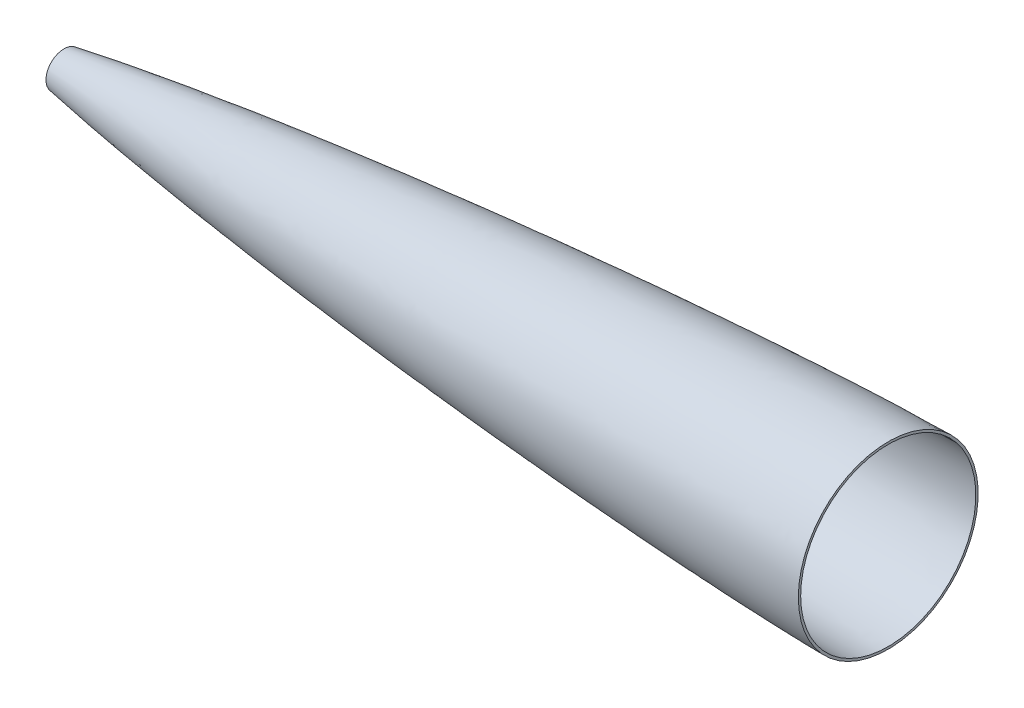
ISO-10303-21;
HEADER;
FILE_DESCRIPTION(('STEP AP214'),'2;1');
FILE_NAME('part.step','',(''),(''),'','','');
FILE_SCHEMA(('AUTOMOTIVE_DESIGN { 1 0 10303 214 1 1 1 1 }'));
ENDSEC;
DATA;
#1=APPLICATION_CONTEXT('core data for automotive mechanical design processes');
#2=APPLICATION_PROTOCOL_DEFINITION('international standard','automotive_design',2000,#1);
#3=PRODUCT_CONTEXT('',#1,'mechanical');
#4=PRODUCT('Part','Part','',(#3));
#5=PRODUCT_RELATED_PRODUCT_CATEGORY('part','',(#4));
#6=PRODUCT_DEFINITION_FORMATION('','',#4);
#7=PRODUCT_DEFINITION_CONTEXT('part definition',#1,'design');
#8=PRODUCT_DEFINITION('design','',#6,#7);
#9=PRODUCT_DEFINITION_SHAPE('','',#8);
#10=(LENGTH_UNIT() NAMED_UNIT(*) SI_UNIT(.MILLI.,.METRE.));
#11=(NAMED_UNIT(*) PLANE_ANGLE_UNIT() SI_UNIT($,.RADIAN.));
#12=(NAMED_UNIT(*) SI_UNIT($,.STERADIAN.) SOLID_ANGLE_UNIT());
#13=UNCERTAINTY_MEASURE_WITH_UNIT(LENGTH_MEASURE(1.E-05),#10,'distance_accuracy_value','');
#14=(GEOMETRIC_REPRESENTATION_CONTEXT(3) GLOBAL_UNCERTAINTY_ASSIGNED_CONTEXT((#13)) GLOBAL_UNIT_ASSIGNED_CONTEXT((#10,
#11,#12)) REPRESENTATION_CONTEXT('',''));
#15=CARTESIAN_POINT('',(0.,0.,0.));
#16=DIRECTION('',(0.,0.,1.));
#17=DIRECTION('',(1.,0.,0.));
#18=AXIS2_PLACEMENT_3D('',#15,#16,#17);
#19=CARTESIAN_POINT('',(-9.71033403695962E-08,16.3896811994679,0.));
#20=DIRECTION('',(-1.,0.,0.));
#21=DIRECTION('',(0.,0.,1.));
#22=AXIS2_PLACEMENT_3D('',#19,#20,#21);
#23=CYLINDRICAL_SURFACE('',#22,13.2512472363895);
#24=CARTESIAN_POINT('',(63.4999999983157,16.3896811994679,0.));
#25=DIRECTION('',(-1.,0.,0.));
#26=DIRECTION('',(0.,0.,1.));
#27=AXIS2_PLACEMENT_3D('',#24,#25,#26);
#28=CIRCLE('',#27,13.2512472363895);
#29=CARTESIAN_POINT('',(63.4999999983157,16.3896811994679,13.2512472363895));
#30=VERTEX_POINT('',#29);
#31=EDGE_CURVE('E66',#30,#30,#28,.T.);
#32=ORIENTED_EDGE('',*,*,#31,.T.);
#33=EDGE_LOOP('',(#32));
#34=FACE_BOUND('',#33,.T.);
#35=CARTESIAN_POINT('',(63.8441480431702,16.3896811994679,0.));
#36=DIRECTION('',(-1.,0.,0.));
#37=DIRECTION('',(0.,0.,1.));
#38=AXIS2_PLACEMENT_3D('',#35,#36,#37);
#39=CIRCLE('',#38,13.2512472363895);
#40=CARTESIAN_POINT('',(63.8441480431702,16.3896811994679,13.2512472363895));
#41=VERTEX_POINT('',#40);
#42=EDGE_CURVE('E10',#41,#41,#39,.T.);
#43=ORIENTED_EDGE('',*,*,#42,.F.);
#44=EDGE_LOOP('',(#43));
#45=FACE_BOUND('',#44,.T.);
#46=ADVANCED_FACE('F43',(#34,#45),#23,.F.);
#47=CARTESIAN_POINT('',(63.8441480431702,29.6409284358574,0.));
#48=CARTESIAN_POINT('',(64.2569729524693,29.7137459730283,0.));
#49=CARTESIAN_POINT('',(65.0708293978638,29.8568257850749,0.));
#50=CARTESIAN_POINT('',(66.7938555062717,30.1579407625321,0.));
#51=CARTESIAN_POINT('',(69.2241202971667,30.5796987517432,0.));
#52=CARTESIAN_POINT('',(72.0515626324549,31.0649373198054,0.));
#53=CARTESIAN_POINT('',(74.5912429618499,31.494439379619,0.));
#54=CARTESIAN_POINT('',(77.2638355229502,31.9425857156162,0.));
#55=CARTESIAN_POINT('',(80.0494972377494,32.4060891517619,0.));
#56=CARTESIAN_POINT('',(82.7701068293772,32.8537045646262,0.));
#57=CARTESIAN_POINT('',(86.3400045662407,33.4346778697686,0.));
#58=CARTESIAN_POINT('',(90.8184817931109,34.1534381788068,0.));
#59=CARTESIAN_POINT('',(98.0781943534533,35.2995708419726,0.));
#60=CARTESIAN_POINT('',(110.666908431756,37.2343192362193,0.));
#61=CARTESIAN_POINT('',(128.759255506819,39.8894677382704,0.));
#62=CARTESIAN_POINT('',(172.156848881921,45.9176547974609,0.));
#63=CARTESIAN_POINT('',(237.43115673763,53.9364603881561,0.));
#64=CARTESIAN_POINT('',(324.621308067493,63.1640517151525,0.));
#65=CARTESIAN_POINT('',(411.938915566134,71.1827099072368,0.));
#66=CARTESIAN_POINT('',(499.350643561552,78.094317145061,0.));
#67=CARTESIAN_POINT('',(572.260680839426,82.9222846023619,0.));
#68=CARTESIAN_POINT('',(630.623773587349,86.1495344361314,0.));
#69=CARTESIAN_POINT('',(674.411620852266,88.2078166422437,0.));
#70=CARTESIAN_POINT('',(710.915033582617,89.5585928557181,0.));
#71=CARTESIAN_POINT('',(736.466558622531,90.2374717175383,0.));
#72=CARTESIAN_POINT('',(751.068941604502,90.5082086517043,0.));
#73=CARTESIAN_POINT('',(758.363506687946,90.6003759881568,0.));
#74=CARTESIAN_POINT('',(762.0014643467,90.6084795704068,0.));
#75=CARTESIAN_POINT('',(762.003291445829,90.6084836278641,0.));
#76=CARTESIAN_POINT('',(762.00439206199,90.608486067794,0.));
#77=B_SPLINE_CURVE_WITH_KNOTS('',3,(#47,#48,#49,#50,#51,#52,#53,#54,#55,#56,#57,#58,#59,#60,#61,
#62,#63,#64,#65,#66,#67,#68,#69,#70,#71,#72,#73,#74,#75,#76),.UNSPECIFIED.,.F.,.F.,(4,1,1,1,1,1,
1,1,1,1,1,1,1,1,1,1,1,1,1,1,1,1,1,1,1,1,1,4),(0.0843978216439633,0.0861861071485649,
0.0879743926531665,0.0915509636623698,0.0951275346715731,0.0987041056807763,0.10228067668998,
0.105857247699183,0.109433818708386,0.113010389717589,0.120163531735996,0.127316673754402,
0.141622957791216,0.170235525864842,0.198848093938468,0.313298366232972,0.427748638527477,
0.542198910821982,0.656649183116486,0.771099455410991,0.828324591558243,0.885549727705495,
0.942774863852748,0.971387431926374,0.985693715963187,0.999992802120339,0.999995681272203,1.),.UNSPECIFIED.);
#78=CARTESIAN_POINT('',(-9.71033403695962E-08,16.3896811994679,0.));
#79=DIRECTION('',(-1.,0.,0.));
#80=AXIS1_PLACEMENT('',#78,#79);
#81=SURFACE_OF_REVOLUTION('',#77,#80);
#82=CARTESIAN_POINT('',(761.999999997366,16.3896811994679,0.));
#83=DIRECTION('',(-1.,0.,0.));
#84=DIRECTION('',(0.,0.,1.));
#85=AXIS2_PLACEMENT_3D('',#82,#83,#84);
#86=CIRCLE('',#85,74.2187951086473);
#87=CARTESIAN_POINT('',(761.999999997366,16.3896811994679,74.2187951086473));
#88=VERTEX_POINT('',#87);
#89=EDGE_CURVE('E50',#88,#88,#86,.T.);
#90=ORIENTED_EDGE('',*,*,#89,.F.);
#91=EDGE_LOOP('',(#90));
#92=FACE_BOUND('',#91,.T.);
#93=ORIENTED_EDGE('',*,*,#42,.T.);
#94=EDGE_LOOP('',(#93));
#95=FACE_BOUND('',#94,.T.);
#96=ADVANCED_FACE('F89',(#92,#95),#81,.T.);
#97=CARTESIAN_POINT('',(761.999999997366,0.,0.));
#98=DIRECTION('',(1.,0.,0.));
#99=DIRECTION('',(0.,0.,-1.));
#100=AXIS2_PLACEMENT_3D('',#97,#98,#99);
#101=PLANE('',#100);
#102=ORIENTED_EDGE('',*,*,#89,.T.);
#103=EDGE_LOOP('',(#102));
#104=FACE_BOUND('',#103,.T.);
#105=CARTESIAN_POINT('',(761.999999997366,16.3896811994679,0.));
#106=DIRECTION('',(-1.,0.,0.));
#107=DIRECTION('',(0.,0.,1.));
#108=AXIS2_PLACEMENT_3D('',#105,#106,#107);
#109=CIRCLE('',#108,76.1999999999999);
#110=CARTESIAN_POINT('',(761.999999997366,16.3896811994679,76.1999999999999));
#111=VERTEX_POINT('',#110);
#112=EDGE_CURVE('E55',#111,#111,#109,.T.);
#113=ORIENTED_EDGE('',*,*,#112,.F.);
#114=EDGE_LOOP('',(#113));
#115=FACE_BOUND('',#114,.T.);
#116=ADVANCED_FACE('F86',(#104,#115),#101,.T.);
#117=CARTESIAN_POINT('',(63.499999998904,31.5920090502436,0.));
#118=CARTESIAN_POINT('',(64.546964266997,31.7766814326294,0.));
#119=CARTESIAN_POINT('',(66.5924716663723,32.134751741802,0.));
#120=CARTESIAN_POINT('',(70.6985270178701,32.8470447992956,0.));
#121=CARTESIAN_POINT('',(74.750398099017,33.5311995277677,0.));
#122=CARTESIAN_POINT('',(80.7859656900528,34.5406150118511,0.));
#123=CARTESIAN_POINT('',(87.4752652652167,35.6288369400894,0.));
#124=CARTESIAN_POINT('',(96.3257296059372,37.0366929198954,0.));
#125=CARTESIAN_POINT('',(106.861463365838,38.6562531658432,0.));
#126=CARTESIAN_POINT('',(118.22470304347,40.3505915935178,0.));
#127=CARTESIAN_POINT('',(130.243974381643,42.0842776316006,0.));
#128=CARTESIAN_POINT('',(142.308182135761,43.7744134873059,0.));
#129=CARTESIAN_POINT('',(154.356468912833,45.4146567812138,0.));
#130=CARTESIAN_POINT('',(166.423528567478,47.014754136161,0.));
#131=CARTESIAN_POINT('',(178.48840310404,48.5740508806655,0.));
#132=CARTESIAN_POINT('',(193.579945060126,50.4777046472213,0.));
#133=CARTESIAN_POINT('',(211.696044953634,52.6919115600313,0.));
#134=CARTESIAN_POINT('',(232.844260116504,55.1816988712186,0.));
#135=CARTESIAN_POINT('',(257.026256813663,57.9095408564646,0.));
#136=CARTESIAN_POINT('',(281.220777935483,60.5285386719691,0.));
#137=CARTESIAN_POINT('',(305.425855288563,63.0451954146764,0.));
#138=CARTESIAN_POINT('',(329.640998599816,65.4647818952552,0.));
#139=CARTESIAN_POINT('',(353.865153298791,67.7912662570575,0.));
#140=CARTESIAN_POINT('',(378.097843922232,70.0277413324078,0.));
#141=CARTESIAN_POINT('',(402.338438174832,72.1764139406652,0.));
#142=CARTESIAN_POINT('',(432.648570943444,74.7544069798196,0.));
#143=CARTESIAN_POINT('',(462.970550935134,77.189937908786,0.));
#144=CARTESIAN_POINT('',(493.303614435001,79.4834912753072,0.));
#145=CARTESIAN_POINT('',(523.647200353718,81.6320952455737,0.));
#146=CARTESIAN_POINT('',(547.928205589296,83.2621052868244,0.));
#147=CARTESIAN_POINT('',(578.286947121987,85.1848719270963,0.));
#148=CARTESIAN_POINT('',(614.729190145913,87.3009436477884,0.));
#149=CARTESIAN_POINT('',(651.185819497341,89.1578826437485,0.));
#150=CARTESIAN_POINT('',(687.656741902255,90.7084980651065,0.));
#151=CARTESIAN_POINT('',(715.948913969452,91.6728322132418,0.));
#152=CARTESIAN_POINT('',(734.069381353359,92.1636988147506,0.));
#153=CARTESIAN_POINT('',(748.096093738308,92.4455678223042,0.));
#154=CARTESIAN_POINT('',(756.040961088737,92.5514764559402,0.));
#155=CARTESIAN_POINT('',(760.01361627169,92.585277632372,0.));
#156=CARTESIAN_POINT('',(761.999999997366,92.5896811994672,0.));
#157=B_SPLINE_CURVE_WITH_KNOTS('',4,(#117,#118,#119,#120,#121,#122,#123,#124,#125,#126,#127,
#128,#129,#130,#131,#132,#133,#134,#135,#136,#137,#138,#139,#140,#141,#142,#143,#144,#145,#146,
#147,#148,#149,#150,#151,#152,#153,#154,#155,#156),.UNSPECIFIED.,.F.,.F.,(5,1,1,1,1,1,1,1,1,1,1,
1,1,1,1,1,1,1,1,1,1,1,1,1,1,1,1,1,1,1,1,1,1,1,1,1,5),(0.0843978216439633,0.090458426969382,
0.0965190322948007,0.102579637620219,0.108640242945638,0.120761453596475,0.132882664247313,
0.148760448820497,0.16463823339368,0.180516017966864,0.196393802540048,0.212271585953406,
0.228149369366765,0.244027152780123,0.259904936193481,0.291660503780052,0.323416071366622,
0.355171639504699,0.386927207642776,0.41868277550004,0.450438343357304,0.482193911163622,
0.51394947896994,0.545705046782637,0.577460614595334,0.640971750263472,0.672727318119499,
0.704482885975527,0.736238453826032,0.767994021676538,0.831505157344712,0.895016292901957,
0.926771860570484,0.958527428239011,0.979263714119506,0.989631857059753,1.),.UNSPECIFIED.);
#158=CARTESIAN_POINT('',(-9.71033403695962E-08,16.3896811994679,0.));
#159=DIRECTION('',(-1.,0.,0.));
#160=AXIS1_PLACEMENT('',#158,#159);
#161=SURFACE_OF_REVOLUTION('',#157,#160);
#162=ORIENTED_EDGE('',*,*,#112,.T.);
#163=EDGE_LOOP('',(#162));
#164=FACE_BOUND('',#163,.T.);
#165=CARTESIAN_POINT('',(63.4999999983157,16.3896811994679,0.));
#166=DIRECTION('',(-1.,0.,0.));
#167=DIRECTION('',(0.,0.,1.));
#168=AXIS2_PLACEMENT_3D('',#165,#166,#167);
#169=CIRCLE('',#168,15.202327850672);
#170=CARTESIAN_POINT('',(63.4999999983157,16.3896811994679,15.202327850672));
#171=VERTEX_POINT('',#170);
#172=EDGE_CURVE('E60',#171,#171,#169,.T.);
#173=ORIENTED_EDGE('',*,*,#172,.F.);
#174=EDGE_LOOP('',(#173));
#175=FACE_BOUND('',#174,.T.);
#176=ADVANCED_FACE('F81',(#164,#175),#161,.F.);
#177=CARTESIAN_POINT('',(63.4999999983157,0.,0.));
#178=DIRECTION('',(-1.,0.,0.));
#179=DIRECTION('',(0.,0.,1.));
#180=AXIS2_PLACEMENT_3D('',#177,#178,#179);
#181=PLANE('',#180);
#182=ORIENTED_EDGE('',*,*,#172,.T.);
#183=EDGE_LOOP('',(#182));
#184=FACE_BOUND('',#183,.T.);
#185=ORIENTED_EDGE('',*,*,#31,.F.);
#186=EDGE_LOOP('',(#185));
#187=FACE_BOUND('',#186,.T.);
#188=ADVANCED_FACE('F85',(#184,#187),#181,.T.);
#189=CLOSED_SHELL('',(#46,#96,#116,#176,#188));
#190=MANIFOLD_SOLID_BREP('B2',#189);
#191=ADVANCED_BREP_SHAPE_REPRESENTATION('',(#18,#190),#14);
#192=SHAPE_DEFINITION_REPRESENTATION(#9,#191);
ENDSEC;
END-ISO-10303-21;
